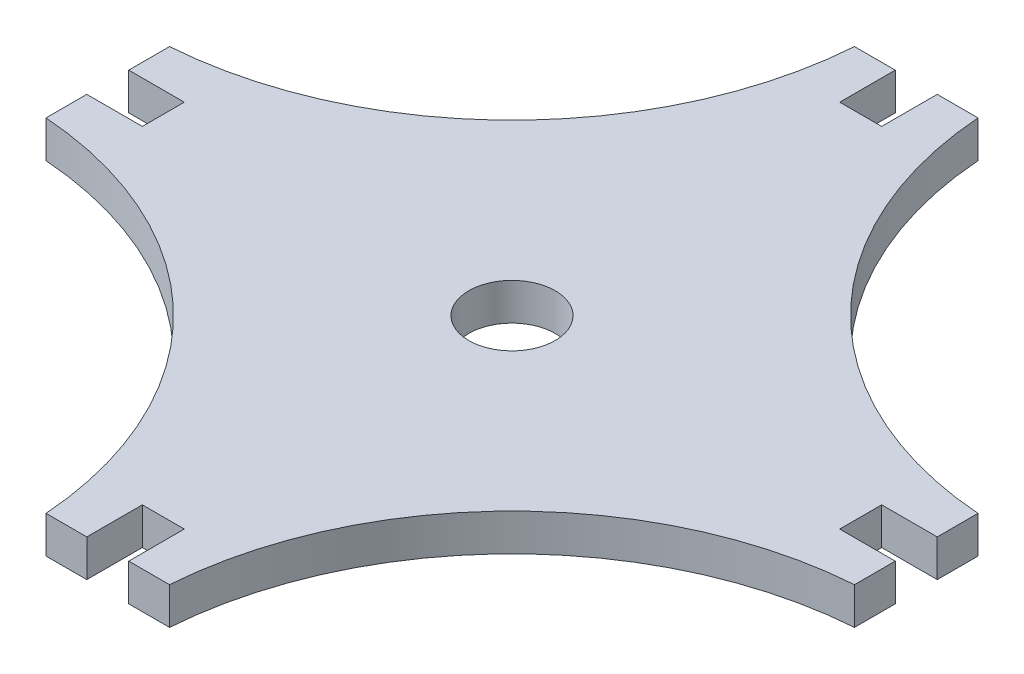
ISO-10303-21;
HEADER;
FILE_DESCRIPTION(('STEP AP214'),'2;1');
FILE_NAME('part.step','',(''),(''),'','','');
FILE_SCHEMA(('AUTOMOTIVE_DESIGN { 1 0 10303 214 1 1 1 1 }'));
ENDSEC;
DATA;
#1=APPLICATION_CONTEXT('core data for automotive mechanical design processes');
#2=APPLICATION_PROTOCOL_DEFINITION('international standard','automotive_design',2000,#1);
#3=PRODUCT_CONTEXT('',#1,'mechanical');
#4=PRODUCT('Part','Part','',(#3));
#5=PRODUCT_RELATED_PRODUCT_CATEGORY('part','',(#4));
#6=PRODUCT_DEFINITION_FORMATION('','',#4);
#7=PRODUCT_DEFINITION_CONTEXT('part definition',#1,'design');
#8=PRODUCT_DEFINITION('design','',#6,#7);
#9=PRODUCT_DEFINITION_SHAPE('','',#8);
#10=(LENGTH_UNIT() NAMED_UNIT(*) SI_UNIT(.MILLI.,.METRE.));
#11=(NAMED_UNIT(*) PLANE_ANGLE_UNIT() SI_UNIT($,.RADIAN.));
#12=(NAMED_UNIT(*) SI_UNIT($,.STERADIAN.) SOLID_ANGLE_UNIT());
#13=UNCERTAINTY_MEASURE_WITH_UNIT(LENGTH_MEASURE(1.E-05),#10,'distance_accuracy_value','');
#14=(GEOMETRIC_REPRESENTATION_CONTEXT(3) GLOBAL_UNCERTAINTY_ASSIGNED_CONTEXT((#13)) GLOBAL_UNIT_ASSIGNED_CONTEXT((#10,
#11,#12)) REPRESENTATION_CONTEXT('',''));
#15=CARTESIAN_POINT('',(0.,0.,0.));
#16=DIRECTION('',(0.,0.,1.));
#17=DIRECTION('',(1.,0.,0.));
#18=AXIS2_PLACEMENT_3D('',#15,#16,#17);
#19=CARTESIAN_POINT('',(34.925,1.5,-34.925));
#20=DIRECTION('',(0.,1.,0.));
#21=DIRECTION('',(0.,0.,1.));
#22=AXIS2_PLACEMENT_3D('',#19,#20,#21);
#23=PLANE('',#22);
#24=DIRECTION('',(0.,0.,1.));
#25=VECTOR('',#24,1.);
#26=CARTESIAN_POINT('',(1.7,1.5,-28.25));
#27=LINE('',#26,#25);
#28=CARTESIAN_POINT('',(1.7,1.5,-32.75));
#29=VERTEX_POINT('',#28);
#30=CARTESIAN_POINT('',(1.7,1.5,-28.25));
#31=VERTEX_POINT('',#30);
#32=EDGE_CURVE('E279',#29,#31,#27,.T.);
#33=ORIENTED_EDGE('',*,*,#32,.T.);
#34=DIRECTION('',(-1.,0.,0.));
#35=VECTOR('',#34,1.);
#36=CARTESIAN_POINT('',(-1.7,1.5,-28.25));
#37=LINE('',#36,#35);
#38=CARTESIAN_POINT('',(-1.7,1.5,-28.25));
#39=VERTEX_POINT('',#38);
#40=EDGE_CURVE('E147',#31,#39,#37,.T.);
#41=ORIENTED_EDGE('',*,*,#40,.T.);
#42=DIRECTION('',(0.,0.,-1.));
#43=VECTOR('',#42,1.);
#44=CARTESIAN_POINT('',(-1.7,1.5,-28.25));
#45=LINE('',#44,#43);
#46=CARTESIAN_POINT('',(-1.7,1.5,-32.75));
#47=VERTEX_POINT('',#46);
#48=EDGE_CURVE('E342',#39,#47,#45,.T.);
#49=ORIENTED_EDGE('',*,*,#48,.T.);
#50=DIRECTION('',(-1.,0.,0.));
#51=VECTOR('',#50,1.);
#52=CARTESIAN_POINT('',(-1.7,1.5,-32.75));
#53=LINE('',#52,#51);
#54=CARTESIAN_POINT('',(-5.00394762880155,1.5,-32.75));
#55=VERTEX_POINT('',#54);
#56=EDGE_CURVE('E361',#47,#55,#53,.T.);
#57=ORIENTED_EDGE('',*,*,#56,.T.);
#58=CARTESIAN_POINT('',(-34.925,1.5,-34.925));
#59=DIRECTION('',(0.,-1.,0.));
#60=DIRECTION('',(0.,0.,-1.));
#61=AXIS2_PLACEMENT_3D('',#58,#59,#60);
#62=CIRCLE('',#61,30.);
#63=CARTESIAN_POINT('',(-32.75,1.5,-5.00394762880155));
#64=VERTEX_POINT('',#63);
#65=EDGE_CURVE('E358',#55,#64,#62,.T.);
#66=ORIENTED_EDGE('',*,*,#65,.T.);
#67=DIRECTION('',(0.,0.,1.));
#68=VECTOR('',#67,1.);
#69=CARTESIAN_POINT('',(-32.75,1.5,-1.7));
#70=LINE('',#69,#68);
#71=CARTESIAN_POINT('',(-32.75,1.5,-1.7));
#72=VERTEX_POINT('',#71);
#73=EDGE_CURVE('E360',#64,#72,#70,.T.);
#74=ORIENTED_EDGE('',*,*,#73,.T.);
#75=DIRECTION('',(1.,0.,0.));
#76=VECTOR('',#75,1.);
#77=CARTESIAN_POINT('',(-28.25,1.5,-1.7));
#78=LINE('',#77,#76);
#79=CARTESIAN_POINT('',(-28.25,1.5,-1.7));
#80=VERTEX_POINT('',#79);
#81=EDGE_CURVE('E363',#72,#80,#78,.T.);
#82=ORIENTED_EDGE('',*,*,#81,.T.);
#83=DIRECTION('',(0.,0.,1.));
#84=VECTOR('',#83,1.);
#85=CARTESIAN_POINT('',(-28.25,1.5,1.7));
#86=LINE('',#85,#84);
#87=CARTESIAN_POINT('',(-28.25,1.5,1.7));
#88=VERTEX_POINT('',#87);
#89=EDGE_CURVE('E369',#80,#88,#86,.T.);
#90=ORIENTED_EDGE('',*,*,#89,.T.);
#91=DIRECTION('',(-1.,0.,0.));
#92=VECTOR('',#91,1.);
#93=CARTESIAN_POINT('',(-28.25,1.5,1.7));
#94=LINE('',#93,#92);
#95=CARTESIAN_POINT('',(-32.75,1.5,1.7));
#96=VERTEX_POINT('',#95);
#97=EDGE_CURVE('E371',#88,#96,#94,.T.);
#98=ORIENTED_EDGE('',*,*,#97,.T.);
#99=DIRECTION('',(0.,0.,1.));
#100=VECTOR('',#99,1.);
#101=CARTESIAN_POINT('',(-32.75,1.5,1.7));
#102=LINE('',#101,#100);
#103=CARTESIAN_POINT('',(-32.75,1.5,5.00394762880155));
#104=VERTEX_POINT('',#103);
#105=EDGE_CURVE('E373',#96,#104,#102,.T.);
#106=ORIENTED_EDGE('',*,*,#105,.T.);
#107=CARTESIAN_POINT('',(-34.925,1.5,34.925));
#108=DIRECTION('',(0.,-1.,0.));
#109=DIRECTION('',(0.,0.,-1.));
#110=AXIS2_PLACEMENT_3D('',#107,#108,#109);
#111=CIRCLE('',#110,30.);
#112=CARTESIAN_POINT('',(-5.00394762880156,1.5,32.75));
#113=VERTEX_POINT('',#112);
#114=EDGE_CURVE('E375',#104,#113,#111,.T.);
#115=ORIENTED_EDGE('',*,*,#114,.T.);
#116=DIRECTION('',(1.,0.,0.));
#117=VECTOR('',#116,1.);
#118=CARTESIAN_POINT('',(-1.7,1.5,32.75));
#119=LINE('',#118,#117);
#120=CARTESIAN_POINT('',(-1.7,1.5,32.75));
#121=VERTEX_POINT('',#120);
#122=EDGE_CURVE('E377',#113,#121,#119,.T.);
#123=ORIENTED_EDGE('',*,*,#122,.T.);
#124=DIRECTION('',(0.,0.,-1.));
#125=VECTOR('',#124,1.);
#126=CARTESIAN_POINT('',(-1.7,1.5,28.25));
#127=LINE('',#126,#125);
#128=CARTESIAN_POINT('',(-1.7,1.5,28.25));
#129=VERTEX_POINT('',#128);
#130=EDGE_CURVE('E379',#121,#129,#127,.T.);
#131=ORIENTED_EDGE('',*,*,#130,.T.);
#132=DIRECTION('',(1.,0.,0.));
#133=VECTOR('',#132,1.);
#134=CARTESIAN_POINT('',(-1.7,1.5,28.25));
#135=LINE('',#134,#133);
#136=CARTESIAN_POINT('',(1.7,1.5,28.25));
#137=VERTEX_POINT('',#136);
#138=EDGE_CURVE('E381',#129,#137,#135,.T.);
#139=ORIENTED_EDGE('',*,*,#138,.T.);
#140=DIRECTION('',(0.,0.,1.));
#141=VECTOR('',#140,1.);
#142=CARTESIAN_POINT('',(1.7,1.5,28.25));
#143=LINE('',#142,#141);
#144=CARTESIAN_POINT('',(1.7,1.5,32.75));
#145=VERTEX_POINT('',#144);
#146=EDGE_CURVE('E383',#137,#145,#143,.T.);
#147=ORIENTED_EDGE('',*,*,#146,.T.);
#148=DIRECTION('',(1.,0.,0.));
#149=VECTOR('',#148,1.);
#150=CARTESIAN_POINT('',(1.7,1.5,32.75));
#151=LINE('',#150,#149);
#152=CARTESIAN_POINT('',(5.00394762880156,1.5,32.75));
#153=VERTEX_POINT('',#152);
#154=EDGE_CURVE('E385',#145,#153,#151,.T.);
#155=ORIENTED_EDGE('',*,*,#154,.T.);
#156=CARTESIAN_POINT('',(34.925,1.5,34.925));
#157=DIRECTION('',(0.,-1.,0.));
#158=DIRECTION('',(0.,0.,-1.));
#159=AXIS2_PLACEMENT_3D('',#156,#157,#158);
#160=CIRCLE('',#159,30.);
#161=CARTESIAN_POINT('',(32.75,1.5,5.00394762880157));
#162=VERTEX_POINT('',#161);
#163=EDGE_CURVE('E387',#153,#162,#160,.T.);
#164=ORIENTED_EDGE('',*,*,#163,.T.);
#165=DIRECTION('',(0.,0.,-1.));
#166=VECTOR('',#165,1.);
#167=CARTESIAN_POINT('',(32.75,1.5,1.7));
#168=LINE('',#167,#166);
#169=CARTESIAN_POINT('',(32.75,1.5,1.7));
#170=VERTEX_POINT('',#169);
#171=EDGE_CURVE('E389',#162,#170,#168,.T.);
#172=ORIENTED_EDGE('',*,*,#171,.T.);
#173=DIRECTION('',(-1.,0.,0.));
#174=VECTOR('',#173,1.);
#175=CARTESIAN_POINT('',(28.25,1.5,1.7));
#176=LINE('',#175,#174);
#177=CARTESIAN_POINT('',(28.25,1.5,1.7));
#178=VERTEX_POINT('',#177);
#179=EDGE_CURVE('E391',#170,#178,#176,.T.);
#180=ORIENTED_EDGE('',*,*,#179,.T.);
#181=DIRECTION('',(0.,0.,-1.));
#182=VECTOR('',#181,1.);
#183=CARTESIAN_POINT('',(28.25,1.5,1.7));
#184=LINE('',#183,#182);
#185=CARTESIAN_POINT('',(28.25,1.5,-1.7));
#186=VERTEX_POINT('',#185);
#187=EDGE_CURVE('E393',#178,#186,#184,.T.);
#188=ORIENTED_EDGE('',*,*,#187,.T.);
#189=DIRECTION('',(1.,0.,0.));
#190=VECTOR('',#189,1.);
#191=CARTESIAN_POINT('',(28.25,1.5,-1.7));
#192=LINE('',#191,#190);
#193=CARTESIAN_POINT('',(32.75,1.5,-1.7));
#194=VERTEX_POINT('',#193);
#195=EDGE_CURVE('E214',#186,#194,#192,.T.);
#196=ORIENTED_EDGE('',*,*,#195,.T.);
#197=DIRECTION('',(0.,0.,-1.));
#198=VECTOR('',#197,1.);
#199=CARTESIAN_POINT('',(32.75,1.5,-1.7));
#200=LINE('',#199,#198);
#201=CARTESIAN_POINT('',(32.75,1.5,-5.00394762880156));
#202=VERTEX_POINT('',#201);
#203=EDGE_CURVE('E208',#194,#202,#200,.T.);
#204=ORIENTED_EDGE('',*,*,#203,.T.);
#205=CARTESIAN_POINT('',(34.925,1.5,-34.925));
#206=DIRECTION('',(0.,-1.,0.));
#207=DIRECTION('',(0.,0.,1.));
#208=AXIS2_PLACEMENT_3D('',#205,#206,#207);
#209=CIRCLE('',#208,30.);
#210=CARTESIAN_POINT('',(5.00394762880155,1.5,-32.75));
#211=VERTEX_POINT('',#210);
#212=EDGE_CURVE('E212',#202,#211,#209,.T.);
#213=ORIENTED_EDGE('',*,*,#212,.T.);
#214=DIRECTION('',(-1.,0.,0.));
#215=VECTOR('',#214,1.);
#216=CARTESIAN_POINT('',(1.7,1.5,-32.75));
#217=LINE('',#216,#215);
#218=EDGE_CURVE('E56',#211,#29,#217,.T.);
#219=ORIENTED_EDGE('',*,*,#218,.T.);
#220=EDGE_LOOP('',(#33,#41,#49,#57,#66,#74,#82,#90,#98,#106,#115,#123,#131,#139,#147,#155,#164,
#172,#180,#188,#196,#204,#213,#219));
#221=FACE_BOUND('',#220,.T.);
#222=CARTESIAN_POINT('',(0.,1.5,0.));
#223=DIRECTION('',(0.,1.,0.));
#224=DIRECTION('',(0.,0.,1.));
#225=AXIS2_PLACEMENT_3D('',#222,#223,#224);
#226=CIRCLE('',#225,3.5);
#227=CARTESIAN_POINT('',(0.,1.5,3.5));
#228=VERTEX_POINT('',#227);
#229=EDGE_CURVE('E236',#228,#228,#226,.T.);
#230=ORIENTED_EDGE('',*,*,#229,.F.);
#231=EDGE_LOOP('',(#230));
#232=FACE_BOUND('',#231,.T.);
#233=ADVANCED_FACE('F39',(#221,#232),#23,.T.);
#234=CARTESIAN_POINT('',(34.925,-1.5,-34.925));
#235=DIRECTION('',(0.,1.,0.));
#236=DIRECTION('',(0.,0.,1.));
#237=AXIS2_PLACEMENT_3D('',#234,#235,#236);
#238=PLANE('',#237);
#239=DIRECTION('',(0.,0.,1.));
#240=VECTOR('',#239,1.);
#241=CARTESIAN_POINT('',(1.7,-1.5,-28.25));
#242=LINE('',#241,#240);
#243=CARTESIAN_POINT('',(1.7,-1.5,-32.75));
#244=VERTEX_POINT('',#243);
#245=CARTESIAN_POINT('',(1.7,-1.5,-28.25));
#246=VERTEX_POINT('',#245);
#247=EDGE_CURVE('E232',#244,#246,#242,.T.);
#248=ORIENTED_EDGE('',*,*,#247,.F.);
#249=DIRECTION('',(-1.,0.,0.));
#250=VECTOR('',#249,1.);
#251=CARTESIAN_POINT('',(1.7,-1.5,-32.75));
#252=LINE('',#251,#250);
#253=CARTESIAN_POINT('',(5.00394762880155,-1.5,-32.75));
#254=VERTEX_POINT('',#253);
#255=EDGE_CURVE('E139',#254,#244,#252,.T.);
#256=ORIENTED_EDGE('',*,*,#255,.F.);
#257=CARTESIAN_POINT('',(34.925,-1.5,-34.925));
#258=DIRECTION('',(0.,-1.,0.));
#259=DIRECTION('',(0.,0.,1.));
#260=AXIS2_PLACEMENT_3D('',#257,#258,#259);
#261=CIRCLE('',#260,30.);
#262=CARTESIAN_POINT('',(32.75,-1.5,-5.00394762880156));
#263=VERTEX_POINT('',#262);
#264=EDGE_CURVE('E133',#263,#254,#261,.T.);
#265=ORIENTED_EDGE('',*,*,#264,.F.);
#266=DIRECTION('',(0.,0.,-1.));
#267=VECTOR('',#266,1.);
#268=CARTESIAN_POINT('',(32.75,-1.5,-1.7));
#269=LINE('',#268,#267);
#270=CARTESIAN_POINT('',(32.75,-1.5,-1.7));
#271=VERTEX_POINT('',#270);
#272=EDGE_CURVE('E222',#271,#263,#269,.T.);
#273=ORIENTED_EDGE('',*,*,#272,.F.);
#274=DIRECTION('',(1.,0.,0.));
#275=VECTOR('',#274,1.);
#276=CARTESIAN_POINT('',(28.25,-1.5,-1.7));
#277=LINE('',#276,#275);
#278=CARTESIAN_POINT('',(28.25,-1.5,-1.7));
#279=VERTEX_POINT('',#278);
#280=EDGE_CURVE('E274',#279,#271,#277,.T.);
#281=ORIENTED_EDGE('',*,*,#280,.F.);
#282=DIRECTION('',(0.,0.,-1.));
#283=VECTOR('',#282,1.);
#284=CARTESIAN_POINT('',(28.25,-1.5,1.7));
#285=LINE('',#284,#283);
#286=CARTESIAN_POINT('',(28.25,-1.5,1.7));
#287=VERTEX_POINT('',#286);
#288=EDGE_CURVE('E272',#287,#279,#285,.T.);
#289=ORIENTED_EDGE('',*,*,#288,.F.);
#290=DIRECTION('',(-1.,0.,0.));
#291=VECTOR('',#290,1.);
#292=CARTESIAN_POINT('',(28.25,-1.5,1.7));
#293=LINE('',#292,#291);
#294=CARTESIAN_POINT('',(32.75,-1.5,1.7));
#295=VERTEX_POINT('',#294);
#296=EDGE_CURVE('E270',#295,#287,#293,.T.);
#297=ORIENTED_EDGE('',*,*,#296,.F.);
#298=DIRECTION('',(0.,0.,-1.));
#299=VECTOR('',#298,1.);
#300=CARTESIAN_POINT('',(32.75,-1.5,1.7));
#301=LINE('',#300,#299);
#302=CARTESIAN_POINT('',(32.75,-1.5,5.00394762880157));
#303=VERTEX_POINT('',#302);
#304=EDGE_CURVE('E268',#303,#295,#301,.T.);
#305=ORIENTED_EDGE('',*,*,#304,.F.);
#306=CARTESIAN_POINT('',(34.925,-1.5,34.925));
#307=DIRECTION('',(0.,-1.,0.));
#308=DIRECTION('',(0.,0.,-1.));
#309=AXIS2_PLACEMENT_3D('',#306,#307,#308);
#310=CIRCLE('',#309,30.);
#311=CARTESIAN_POINT('',(5.00394762880156,-1.5,32.75));
#312=VERTEX_POINT('',#311);
#313=EDGE_CURVE('E266',#312,#303,#310,.T.);
#314=ORIENTED_EDGE('',*,*,#313,.F.);
#315=DIRECTION('',(1.,0.,0.));
#316=VECTOR('',#315,1.);
#317=CARTESIAN_POINT('',(1.7,-1.5,32.75));
#318=LINE('',#317,#316);
#319=CARTESIAN_POINT('',(1.7,-1.5,32.75));
#320=VERTEX_POINT('',#319);
#321=EDGE_CURVE('E264',#320,#312,#318,.T.);
#322=ORIENTED_EDGE('',*,*,#321,.F.);
#323=DIRECTION('',(0.,0.,1.));
#324=VECTOR('',#323,1.);
#325=CARTESIAN_POINT('',(1.7,-1.5,28.25));
#326=LINE('',#325,#324);
#327=CARTESIAN_POINT('',(1.7,-1.5,28.25));
#328=VERTEX_POINT('',#327);
#329=EDGE_CURVE('E262',#328,#320,#326,.T.);
#330=ORIENTED_EDGE('',*,*,#329,.F.);
#331=DIRECTION('',(1.,0.,0.));
#332=VECTOR('',#331,1.);
#333=CARTESIAN_POINT('',(-1.7,-1.5,28.25));
#334=LINE('',#333,#332);
#335=CARTESIAN_POINT('',(-1.7,-1.5,28.25));
#336=VERTEX_POINT('',#335);
#337=EDGE_CURVE('E260',#336,#328,#334,.T.);
#338=ORIENTED_EDGE('',*,*,#337,.F.);
#339=DIRECTION('',(0.,0.,-1.));
#340=VECTOR('',#339,1.);
#341=CARTESIAN_POINT('',(-1.7,-1.5,28.25));
#342=LINE('',#341,#340);
#343=CARTESIAN_POINT('',(-1.7,-1.5,32.75));
#344=VERTEX_POINT('',#343);
#345=EDGE_CURVE('E258',#344,#336,#342,.T.);
#346=ORIENTED_EDGE('',*,*,#345,.F.);
#347=DIRECTION('',(1.,0.,0.));
#348=VECTOR('',#347,1.);
#349=CARTESIAN_POINT('',(-1.7,-1.5,32.75));
#350=LINE('',#349,#348);
#351=CARTESIAN_POINT('',(-5.00394762880156,-1.5,32.75));
#352=VERTEX_POINT('',#351);
#353=EDGE_CURVE('E256',#352,#344,#350,.T.);
#354=ORIENTED_EDGE('',*,*,#353,.F.);
#355=CARTESIAN_POINT('',(-34.925,-1.5,34.925));
#356=DIRECTION('',(0.,-1.,0.));
#357=DIRECTION('',(0.,0.,-1.));
#358=AXIS2_PLACEMENT_3D('',#355,#356,#357);
#359=CIRCLE('',#358,30.);
#360=CARTESIAN_POINT('',(-32.75,-1.5,5.00394762880155));
#361=VERTEX_POINT('',#360);
#362=EDGE_CURVE('E254',#361,#352,#359,.T.);
#363=ORIENTED_EDGE('',*,*,#362,.F.);
#364=DIRECTION('',(0.,0.,1.));
#365=VECTOR('',#364,1.);
#366=CARTESIAN_POINT('',(-32.75,-1.5,1.7));
#367=LINE('',#366,#365);
#368=CARTESIAN_POINT('',(-32.75,-1.5,1.7));
#369=VERTEX_POINT('',#368);
#370=EDGE_CURVE('E252',#369,#361,#367,.T.);
#371=ORIENTED_EDGE('',*,*,#370,.F.);
#372=DIRECTION('',(-1.,0.,0.));
#373=VECTOR('',#372,1.);
#374=CARTESIAN_POINT('',(-28.25,-1.5,1.7));
#375=LINE('',#374,#373);
#376=CARTESIAN_POINT('',(-28.25,-1.5,1.7));
#377=VERTEX_POINT('',#376);
#378=EDGE_CURVE('E250',#377,#369,#375,.T.);
#379=ORIENTED_EDGE('',*,*,#378,.F.);
#380=DIRECTION('',(0.,0.,1.));
#381=VECTOR('',#380,1.);
#382=CARTESIAN_POINT('',(-28.25,-1.5,1.7));
#383=LINE('',#382,#381);
#384=CARTESIAN_POINT('',(-28.25,-1.5,-1.7));
#385=VERTEX_POINT('',#384);
#386=EDGE_CURVE('E248',#385,#377,#383,.T.);
#387=ORIENTED_EDGE('',*,*,#386,.F.);
#388=DIRECTION('',(1.,0.,0.));
#389=VECTOR('',#388,1.);
#390=CARTESIAN_POINT('',(-28.25,-1.5,-1.7));
#391=LINE('',#390,#389);
#392=CARTESIAN_POINT('',(-32.75,-1.5,-1.7));
#393=VERTEX_POINT('',#392);
#394=EDGE_CURVE('E246',#393,#385,#391,.T.);
#395=ORIENTED_EDGE('',*,*,#394,.F.);
#396=DIRECTION('',(0.,0.,1.));
#397=VECTOR('',#396,1.);
#398=CARTESIAN_POINT('',(-32.75,-1.5,-1.7));
#399=LINE('',#398,#397);
#400=CARTESIAN_POINT('',(-32.75,-1.5,-5.00394762880155));
#401=VERTEX_POINT('',#400);
#402=EDGE_CURVE('E244',#401,#393,#399,.T.);
#403=ORIENTED_EDGE('',*,*,#402,.F.);
#404=CARTESIAN_POINT('',(-34.925,-1.5,-34.925));
#405=DIRECTION('',(0.,-1.,0.));
#406=DIRECTION('',(0.,0.,-1.));
#407=AXIS2_PLACEMENT_3D('',#404,#405,#406);
#408=CIRCLE('',#407,30.);
#409=CARTESIAN_POINT('',(-5.00394762880155,-1.5,-32.75));
#410=VERTEX_POINT('',#409);
#411=EDGE_CURVE('E242',#410,#401,#408,.T.);
#412=ORIENTED_EDGE('',*,*,#411,.F.);
#413=DIRECTION('',(-1.,0.,0.));
#414=VECTOR('',#413,1.);
#415=CARTESIAN_POINT('',(-1.7,-1.5,-32.75));
#416=LINE('',#415,#414);
#417=CARTESIAN_POINT('',(-1.7,-1.5,-32.75));
#418=VERTEX_POINT('',#417);
#419=EDGE_CURVE('E240',#418,#410,#416,.T.);
#420=ORIENTED_EDGE('',*,*,#419,.F.);
#421=DIRECTION('',(0.,0.,-1.));
#422=VECTOR('',#421,1.);
#423=CARTESIAN_POINT('',(-1.7,-1.5,-28.25));
#424=LINE('',#423,#422);
#425=CARTESIAN_POINT('',(-1.7,-1.5,-28.25));
#426=VERTEX_POINT('',#425);
#427=EDGE_CURVE('E238',#426,#418,#424,.T.);
#428=ORIENTED_EDGE('',*,*,#427,.F.);
#429=DIRECTION('',(-1.,0.,0.));
#430=VECTOR('',#429,1.);
#431=CARTESIAN_POINT('',(-1.7,-1.5,-28.25));
#432=LINE('',#431,#430);
#433=EDGE_CURVE('E235',#246,#426,#432,.T.);
#434=ORIENTED_EDGE('',*,*,#433,.F.);
#435=EDGE_LOOP('',(#248,#256,#265,#273,#281,#289,#297,#305,#314,#322,#330,#338,#346,#354,#363,
#371,#379,#387,#395,#403,#412,#420,#428,#434));
#436=FACE_BOUND('',#435,.T.);
#437=CARTESIAN_POINT('',(0.,-1.5,0.));
#438=DIRECTION('',(0.,1.,0.));
#439=DIRECTION('',(0.,0.,1.));
#440=AXIS2_PLACEMENT_3D('',#437,#438,#439);
#441=CIRCLE('',#440,3.5);
#442=CARTESIAN_POINT('',(0.,-1.5,3.5));
#443=VERTEX_POINT('',#442);
#444=EDGE_CURVE('E696',#443,#443,#441,.T.);
#445=ORIENTED_EDGE('',*,*,#444,.T.);
#446=EDGE_LOOP('',(#445));
#447=FACE_BOUND('',#446,.T.);
#448=ADVANCED_FACE('F346',(#436,#447),#238,.F.);
#449=CARTESIAN_POINT('',(1.7,1.5,-28.25));
#450=DIRECTION('',(1.,0.,0.));
#451=DIRECTION('',(0.,0.,-1.));
#452=AXIS2_PLACEMENT_3D('',#449,#450,#451);
#453=PLANE('',#452);
#454=ORIENTED_EDGE('',*,*,#247,.T.);
#455=DIRECTION('',(0.,-1.,0.));
#456=VECTOR('',#455,1.);
#457=CARTESIAN_POINT('',(1.7,1.5,-28.25));
#458=LINE('',#457,#456);
#459=EDGE_CURVE('E11',#31,#246,#458,.T.);
#460=ORIENTED_EDGE('',*,*,#459,.F.);
#461=ORIENTED_EDGE('',*,*,#32,.F.);
#462=DIRECTION('',(0.,-1.,0.));
#463=VECTOR('',#462,1.);
#464=CARTESIAN_POINT('',(1.7,1.5,-32.75));
#465=LINE('',#464,#463);
#466=EDGE_CURVE('E228',#29,#244,#465,.T.);
#467=ORIENTED_EDGE('',*,*,#466,.T.);
#468=EDGE_LOOP('',(#454,#460,#461,#467));
#469=FACE_BOUND('',#468,.T.);
#470=ADVANCED_FACE('F41',(#469),#453,.F.);
#471=CARTESIAN_POINT('',(-1.7,1.5,-28.25));
#472=DIRECTION('',(0.,0.,1.));
#473=DIRECTION('',(1.,0.,0.));
#474=AXIS2_PLACEMENT_3D('',#471,#472,#473);
#475=PLANE('',#474);
#476=ORIENTED_EDGE('',*,*,#433,.T.);
#477=DIRECTION('',(0.,-1.,0.));
#478=VECTOR('',#477,1.);
#479=CARTESIAN_POINT('',(-1.7,1.5,-28.25));
#480=LINE('',#479,#478);
#481=EDGE_CURVE('E48',#39,#426,#480,.T.);
#482=ORIENTED_EDGE('',*,*,#481,.F.);
#483=ORIENTED_EDGE('',*,*,#40,.F.);
#484=ORIENTED_EDGE('',*,*,#459,.T.);
#485=EDGE_LOOP('',(#476,#482,#483,#484));
#486=FACE_BOUND('',#485,.T.);
#487=ADVANCED_FACE('F427',(#486),#475,.F.);
#488=CARTESIAN_POINT('',(-1.7,1.5,-28.25));
#489=DIRECTION('',(-1.,0.,0.));
#490=DIRECTION('',(0.,0.,1.));
#491=AXIS2_PLACEMENT_3D('',#488,#489,#490);
#492=PLANE('',#491);
#493=ORIENTED_EDGE('',*,*,#427,.T.);
#494=DIRECTION('',(0.,-1.,0.));
#495=VECTOR('',#494,1.);
#496=CARTESIAN_POINT('',(-1.7,1.5,-32.75));
#497=LINE('',#496,#495);
#498=EDGE_CURVE('E334',#47,#418,#497,.T.);
#499=ORIENTED_EDGE('',*,*,#498,.F.);
#500=ORIENTED_EDGE('',*,*,#48,.F.);
#501=ORIENTED_EDGE('',*,*,#481,.T.);
#502=EDGE_LOOP('',(#493,#499,#500,#501));
#503=FACE_BOUND('',#502,.T.);
#504=ADVANCED_FACE('F340',(#503),#492,.F.);
#505=CARTESIAN_POINT('',(-1.7,1.5,-32.75));
#506=DIRECTION('',(0.,0.,1.));
#507=DIRECTION('',(1.,0.,0.));
#508=AXIS2_PLACEMENT_3D('',#505,#506,#507);
#509=PLANE('',#508);
#510=ORIENTED_EDGE('',*,*,#419,.T.);
#511=DIRECTION('',(0.,-1.,0.));
#512=VECTOR('',#511,1.);
#513=CARTESIAN_POINT('',(-5.00394762880155,1.5,-32.75));
#514=LINE('',#513,#512);
#515=EDGE_CURVE('E331',#55,#410,#514,.T.);
#516=ORIENTED_EDGE('',*,*,#515,.F.);
#517=ORIENTED_EDGE('',*,*,#56,.F.);
#518=ORIENTED_EDGE('',*,*,#498,.T.);
#519=EDGE_LOOP('',(#510,#516,#517,#518));
#520=FACE_BOUND('',#519,.T.);
#521=ADVANCED_FACE('F352',(#520),#509,.F.);
#522=CARTESIAN_POINT('',(-34.925,1.5,-34.925));
#523=DIRECTION('',(0.,-1.,0.));
#524=DIRECTION('',(0.,0.,-1.));
#525=AXIS2_PLACEMENT_3D('',#522,#523,#524);
#526=CYLINDRICAL_SURFACE('',#525,30.);
#527=ORIENTED_EDGE('',*,*,#411,.T.);
#528=DIRECTION('',(0.,-1.,0.));
#529=VECTOR('',#528,1.);
#530=CARTESIAN_POINT('',(-32.75,1.5,-5.00394762880155));
#531=LINE('',#530,#529);
#532=EDGE_CURVE('E328',#64,#401,#531,.T.);
#533=ORIENTED_EDGE('',*,*,#532,.F.);
#534=ORIENTED_EDGE('',*,*,#65,.F.);
#535=ORIENTED_EDGE('',*,*,#515,.T.);
#536=EDGE_LOOP('',(#527,#533,#534,#535));
#537=FACE_BOUND('',#536,.T.);
#538=ADVANCED_FACE('F356',(#537),#526,.F.);
#539=CARTESIAN_POINT('',(-32.75,1.5,-1.7));
#540=DIRECTION('',(1.,0.,0.));
#541=DIRECTION('',(0.,0.,-1.));
#542=AXIS2_PLACEMENT_3D('',#539,#540,#541);
#543=PLANE('',#542);
#544=ORIENTED_EDGE('',*,*,#402,.T.);
#545=DIRECTION('',(0.,-1.,0.));
#546=VECTOR('',#545,1.);
#547=CARTESIAN_POINT('',(-32.75,1.5,-1.7));
#548=LINE('',#547,#546);
#549=EDGE_CURVE('E325',#72,#393,#548,.T.);
#550=ORIENTED_EDGE('',*,*,#549,.F.);
#551=ORIENTED_EDGE('',*,*,#73,.F.);
#552=ORIENTED_EDGE('',*,*,#532,.T.);
#553=EDGE_LOOP('',(#544,#550,#551,#552));
#554=FACE_BOUND('',#553,.T.);
#555=ADVANCED_FACE('F440',(#554),#543,.F.);
#556=CARTESIAN_POINT('',(-28.25,1.5,-1.7));
#557=DIRECTION('',(0.,0.,-1.));
#558=DIRECTION('',(-1.,0.,0.));
#559=AXIS2_PLACEMENT_3D('',#556,#557,#558);
#560=PLANE('',#559);
#561=ORIENTED_EDGE('',*,*,#394,.T.);
#562=DIRECTION('',(0.,-1.,0.));
#563=VECTOR('',#562,1.);
#564=CARTESIAN_POINT('',(-28.25,1.5,-1.7));
#565=LINE('',#564,#563);
#566=EDGE_CURVE('E322',#80,#385,#565,.T.);
#567=ORIENTED_EDGE('',*,*,#566,.F.);
#568=ORIENTED_EDGE('',*,*,#81,.F.);
#569=ORIENTED_EDGE('',*,*,#549,.T.);
#570=EDGE_LOOP('',(#561,#567,#568,#569));
#571=FACE_BOUND('',#570,.T.);
#572=ADVANCED_FACE('F443',(#571),#560,.F.);
#573=CARTESIAN_POINT('',(-28.25,1.5,1.7));
#574=DIRECTION('',(1.,0.,0.));
#575=DIRECTION('',(0.,0.,-1.));
#576=AXIS2_PLACEMENT_3D('',#573,#574,#575);
#577=PLANE('',#576);
#578=ORIENTED_EDGE('',*,*,#386,.T.);
#579=DIRECTION('',(0.,-1.,0.));
#580=VECTOR('',#579,1.);
#581=CARTESIAN_POINT('',(-28.25,1.5,1.7));
#582=LINE('',#581,#580);
#583=EDGE_CURVE('E319',#88,#377,#582,.T.);
#584=ORIENTED_EDGE('',*,*,#583,.F.);
#585=ORIENTED_EDGE('',*,*,#89,.F.);
#586=ORIENTED_EDGE('',*,*,#566,.T.);
#587=EDGE_LOOP('',(#578,#584,#585,#586));
#588=FACE_BOUND('',#587,.T.);
#589=ADVANCED_FACE('F447',(#588),#577,.F.);
#590=CARTESIAN_POINT('',(-28.25,1.5,1.7));
#591=DIRECTION('',(0.,0.,1.));
#592=DIRECTION('',(1.,0.,0.));
#593=AXIS2_PLACEMENT_3D('',#590,#591,#592);
#594=PLANE('',#593);
#595=ORIENTED_EDGE('',*,*,#378,.T.);
#596=DIRECTION('',(0.,-1.,0.));
#597=VECTOR('',#596,1.);
#598=CARTESIAN_POINT('',(-32.75,1.5,1.7));
#599=LINE('',#598,#597);
#600=EDGE_CURVE('E316',#96,#369,#599,.T.);
#601=ORIENTED_EDGE('',*,*,#600,.F.);
#602=ORIENTED_EDGE('',*,*,#97,.F.);
#603=ORIENTED_EDGE('',*,*,#583,.T.);
#604=EDGE_LOOP('',(#595,#601,#602,#603));
#605=FACE_BOUND('',#604,.T.);
#606=ADVANCED_FACE('F451',(#605),#594,.F.);
#607=CARTESIAN_POINT('',(-32.75,1.5,1.7));
#608=DIRECTION('',(1.,0.,0.));
#609=DIRECTION('',(0.,0.,-1.));
#610=AXIS2_PLACEMENT_3D('',#607,#608,#609);
#611=PLANE('',#610);
#612=ORIENTED_EDGE('',*,*,#370,.T.);
#613=DIRECTION('',(0.,-1.,0.));
#614=VECTOR('',#613,1.);
#615=CARTESIAN_POINT('',(-32.75,1.5,5.00394762880155));
#616=LINE('',#615,#614);
#617=EDGE_CURVE('E313',#104,#361,#616,.T.);
#618=ORIENTED_EDGE('',*,*,#617,.F.);
#619=ORIENTED_EDGE('',*,*,#105,.F.);
#620=ORIENTED_EDGE('',*,*,#600,.T.);
#621=EDGE_LOOP('',(#612,#618,#619,#620));
#622=FACE_BOUND('',#621,.T.);
#623=ADVANCED_FACE('F455',(#622),#611,.F.);
#624=CARTESIAN_POINT('',(-34.925,1.5,34.925));
#625=DIRECTION('',(0.,-1.,0.));
#626=DIRECTION('',(0.,0.,-1.));
#627=AXIS2_PLACEMENT_3D('',#624,#625,#626);
#628=CYLINDRICAL_SURFACE('',#627,30.);
#629=ORIENTED_EDGE('',*,*,#362,.T.);
#630=DIRECTION('',(0.,-1.,0.));
#631=VECTOR('',#630,1.);
#632=CARTESIAN_POINT('',(-5.00394762880156,1.5,32.75));
#633=LINE('',#632,#631);
#634=EDGE_CURVE('E310',#113,#352,#633,.T.);
#635=ORIENTED_EDGE('',*,*,#634,.F.);
#636=ORIENTED_EDGE('',*,*,#114,.F.);
#637=ORIENTED_EDGE('',*,*,#617,.T.);
#638=EDGE_LOOP('',(#629,#635,#636,#637));
#639=FACE_BOUND('',#638,.T.);
#640=ADVANCED_FACE('F459',(#639),#628,.F.);
#641=CARTESIAN_POINT('',(-1.7,1.5,32.75));
#642=DIRECTION('',(0.,0.,-1.));
#643=DIRECTION('',(-1.,0.,0.));
#644=AXIS2_PLACEMENT_3D('',#641,#642,#643);
#645=PLANE('',#644);
#646=ORIENTED_EDGE('',*,*,#353,.T.);
#647=DIRECTION('',(0.,-1.,0.));
#648=VECTOR('',#647,1.);
#649=CARTESIAN_POINT('',(-1.7,1.5,32.75));
#650=LINE('',#649,#648);
#651=EDGE_CURVE('E307',#121,#344,#650,.T.);
#652=ORIENTED_EDGE('',*,*,#651,.F.);
#653=ORIENTED_EDGE('',*,*,#122,.F.);
#654=ORIENTED_EDGE('',*,*,#634,.T.);
#655=EDGE_LOOP('',(#646,#652,#653,#654));
#656=FACE_BOUND('',#655,.T.);
#657=ADVANCED_FACE('F463',(#656),#645,.F.);
#658=CARTESIAN_POINT('',(-1.7,1.5,28.25));
#659=DIRECTION('',(-1.,0.,0.));
#660=DIRECTION('',(0.,0.,1.));
#661=AXIS2_PLACEMENT_3D('',#658,#659,#660);
#662=PLANE('',#661);
#663=ORIENTED_EDGE('',*,*,#345,.T.);
#664=DIRECTION('',(0.,-1.,0.));
#665=VECTOR('',#664,1.);
#666=CARTESIAN_POINT('',(-1.7,1.5,28.25));
#667=LINE('',#666,#665);
#668=EDGE_CURVE('E304',#129,#336,#667,.T.);
#669=ORIENTED_EDGE('',*,*,#668,.F.);
#670=ORIENTED_EDGE('',*,*,#130,.F.);
#671=ORIENTED_EDGE('',*,*,#651,.T.);
#672=EDGE_LOOP('',(#663,#669,#670,#671));
#673=FACE_BOUND('',#672,.T.);
#674=ADVANCED_FACE('F467',(#673),#662,.F.);
#675=CARTESIAN_POINT('',(-1.7,1.5,28.25));
#676=DIRECTION('',(0.,0.,-1.));
#677=DIRECTION('',(-1.,0.,0.));
#678=AXIS2_PLACEMENT_3D('',#675,#676,#677);
#679=PLANE('',#678);
#680=ORIENTED_EDGE('',*,*,#337,.T.);
#681=DIRECTION('',(0.,-1.,0.));
#682=VECTOR('',#681,1.);
#683=CARTESIAN_POINT('',(1.7,1.5,28.25));
#684=LINE('',#683,#682);
#685=EDGE_CURVE('E301',#137,#328,#684,.T.);
#686=ORIENTED_EDGE('',*,*,#685,.F.);
#687=ORIENTED_EDGE('',*,*,#138,.F.);
#688=ORIENTED_EDGE('',*,*,#668,.T.);
#689=EDGE_LOOP('',(#680,#686,#687,#688));
#690=FACE_BOUND('',#689,.T.);
#691=ADVANCED_FACE('F471',(#690),#679,.F.);
#692=CARTESIAN_POINT('',(1.7,1.5,28.25));
#693=DIRECTION('',(1.,0.,0.));
#694=DIRECTION('',(0.,0.,-1.));
#695=AXIS2_PLACEMENT_3D('',#692,#693,#694);
#696=PLANE('',#695);
#697=ORIENTED_EDGE('',*,*,#329,.T.);
#698=DIRECTION('',(0.,-1.,0.));
#699=VECTOR('',#698,1.);
#700=CARTESIAN_POINT('',(1.7,1.5,32.75));
#701=LINE('',#700,#699);
#702=EDGE_CURVE('E298',#145,#320,#701,.T.);
#703=ORIENTED_EDGE('',*,*,#702,.F.);
#704=ORIENTED_EDGE('',*,*,#146,.F.);
#705=ORIENTED_EDGE('',*,*,#685,.T.);
#706=EDGE_LOOP('',(#697,#703,#704,#705));
#707=FACE_BOUND('',#706,.T.);
#708=ADVANCED_FACE('F475',(#707),#696,.F.);
#709=CARTESIAN_POINT('',(1.7,1.5,32.75));
#710=DIRECTION('',(0.,0.,-1.));
#711=DIRECTION('',(-1.,0.,0.));
#712=AXIS2_PLACEMENT_3D('',#709,#710,#711);
#713=PLANE('',#712);
#714=ORIENTED_EDGE('',*,*,#321,.T.);
#715=DIRECTION('',(0.,-1.,0.));
#716=VECTOR('',#715,1.);
#717=CARTESIAN_POINT('',(5.00394762880156,1.5,32.75));
#718=LINE('',#717,#716);
#719=EDGE_CURVE('E295',#153,#312,#718,.T.);
#720=ORIENTED_EDGE('',*,*,#719,.F.);
#721=ORIENTED_EDGE('',*,*,#154,.F.);
#722=ORIENTED_EDGE('',*,*,#702,.T.);
#723=EDGE_LOOP('',(#714,#720,#721,#722));
#724=FACE_BOUND('',#723,.T.);
#725=ADVANCED_FACE('F479',(#724),#713,.F.);
#726=CARTESIAN_POINT('',(34.925,1.5,34.925));
#727=DIRECTION('',(0.,-1.,0.));
#728=DIRECTION('',(0.,0.,-1.));
#729=AXIS2_PLACEMENT_3D('',#726,#727,#728);
#730=CYLINDRICAL_SURFACE('',#729,30.);
#731=ORIENTED_EDGE('',*,*,#313,.T.);
#732=DIRECTION('',(0.,-1.,0.));
#733=VECTOR('',#732,1.);
#734=CARTESIAN_POINT('',(32.75,1.5,5.00394762880157));
#735=LINE('',#734,#733);
#736=EDGE_CURVE('E292',#162,#303,#735,.T.);
#737=ORIENTED_EDGE('',*,*,#736,.F.);
#738=ORIENTED_EDGE('',*,*,#163,.F.);
#739=ORIENTED_EDGE('',*,*,#719,.T.);
#740=EDGE_LOOP('',(#731,#737,#738,#739));
#741=FACE_BOUND('',#740,.T.);
#742=ADVANCED_FACE('F483',(#741),#730,.F.);
#743=CARTESIAN_POINT('',(32.75,1.5,1.7));
#744=DIRECTION('',(-1.,0.,0.));
#745=DIRECTION('',(0.,0.,1.));
#746=AXIS2_PLACEMENT_3D('',#743,#744,#745);
#747=PLANE('',#746);
#748=ORIENTED_EDGE('',*,*,#304,.T.);
#749=DIRECTION('',(0.,-1.,0.));
#750=VECTOR('',#749,1.);
#751=CARTESIAN_POINT('',(32.75,1.5,1.7));
#752=LINE('',#751,#750);
#753=EDGE_CURVE('E289',#170,#295,#752,.T.);
#754=ORIENTED_EDGE('',*,*,#753,.F.);
#755=ORIENTED_EDGE('',*,*,#171,.F.);
#756=ORIENTED_EDGE('',*,*,#736,.T.);
#757=EDGE_LOOP('',(#748,#754,#755,#756));
#758=FACE_BOUND('',#757,.T.);
#759=ADVANCED_FACE('F487',(#758),#747,.F.);
#760=CARTESIAN_POINT('',(28.25,1.5,1.7));
#761=DIRECTION('',(0.,0.,1.));
#762=DIRECTION('',(1.,0.,0.));
#763=AXIS2_PLACEMENT_3D('',#760,#761,#762);
#764=PLANE('',#763);
#765=ORIENTED_EDGE('',*,*,#296,.T.);
#766=DIRECTION('',(0.,-1.,0.));
#767=VECTOR('',#766,1.);
#768=CARTESIAN_POINT('',(28.25,1.5,1.7));
#769=LINE('',#768,#767);
#770=EDGE_CURVE('E286',#178,#287,#769,.T.);
#771=ORIENTED_EDGE('',*,*,#770,.F.);
#772=ORIENTED_EDGE('',*,*,#179,.F.);
#773=ORIENTED_EDGE('',*,*,#753,.T.);
#774=EDGE_LOOP('',(#765,#771,#772,#773));
#775=FACE_BOUND('',#774,.T.);
#776=ADVANCED_FACE('F491',(#775),#764,.F.);
#777=CARTESIAN_POINT('',(28.25,1.5,1.7));
#778=DIRECTION('',(-1.,0.,0.));
#779=DIRECTION('',(0.,0.,1.));
#780=AXIS2_PLACEMENT_3D('',#777,#778,#779);
#781=PLANE('',#780);
#782=ORIENTED_EDGE('',*,*,#288,.T.);
#783=DIRECTION('',(0.,-1.,0.));
#784=VECTOR('',#783,1.);
#785=CARTESIAN_POINT('',(28.25,1.5,-1.7));
#786=LINE('',#785,#784);
#787=EDGE_CURVE('E283',#186,#279,#786,.T.);
#788=ORIENTED_EDGE('',*,*,#787,.F.);
#789=ORIENTED_EDGE('',*,*,#187,.F.);
#790=ORIENTED_EDGE('',*,*,#770,.T.);
#791=EDGE_LOOP('',(#782,#788,#789,#790));
#792=FACE_BOUND('',#791,.T.);
#793=ADVANCED_FACE('F399',(#792),#781,.F.);
#794=CARTESIAN_POINT('',(28.25,1.5,-1.7));
#795=DIRECTION('',(0.,0.,-1.));
#796=DIRECTION('',(-1.,0.,0.));
#797=AXIS2_PLACEMENT_3D('',#794,#795,#796);
#798=PLANE('',#797);
#799=ORIENTED_EDGE('',*,*,#280,.T.);
#800=DIRECTION('',(0.,-1.,0.));
#801=VECTOR('',#800,1.);
#802=CARTESIAN_POINT('',(32.75,1.5,-1.7));
#803=LINE('',#802,#801);
#804=EDGE_CURVE('E223',#194,#271,#803,.T.);
#805=ORIENTED_EDGE('',*,*,#804,.F.);
#806=ORIENTED_EDGE('',*,*,#195,.F.);
#807=ORIENTED_EDGE('',*,*,#787,.T.);
#808=EDGE_LOOP('',(#799,#805,#806,#807));
#809=FACE_BOUND('',#808,.T.);
#810=ADVANCED_FACE('F403',(#809),#798,.F.);
#811=CARTESIAN_POINT('',(32.75,1.5,-1.7));
#812=DIRECTION('',(-1.,0.,0.));
#813=DIRECTION('',(0.,0.,1.));
#814=AXIS2_PLACEMENT_3D('',#811,#812,#813);
#815=PLANE('',#814);
#816=ORIENTED_EDGE('',*,*,#272,.T.);
#817=DIRECTION('',(0.,-1.,0.));
#818=VECTOR('',#817,1.);
#819=CARTESIAN_POINT('',(32.75,1.5,-5.00394762880156));
#820=LINE('',#819,#818);
#821=EDGE_CURVE('E219',#202,#263,#820,.T.);
#822=ORIENTED_EDGE('',*,*,#821,.F.);
#823=ORIENTED_EDGE('',*,*,#203,.F.);
#824=ORIENTED_EDGE('',*,*,#804,.T.);
#825=EDGE_LOOP('',(#816,#822,#823,#824));
#826=FACE_BOUND('',#825,.T.);
#827=ADVANCED_FACE('F220',(#826),#815,.F.);
#828=CARTESIAN_POINT('',(34.925,1.5,-34.925));
#829=DIRECTION('',(0.,-1.,0.));
#830=DIRECTION('',(0.,0.,-1.));
#831=AXIS2_PLACEMENT_3D('',#828,#829,#830);
#832=CYLINDRICAL_SURFACE('',#831,30.);
#833=ORIENTED_EDGE('',*,*,#264,.T.);
#834=DIRECTION('',(0.,-1.,0.));
#835=VECTOR('',#834,1.);
#836=CARTESIAN_POINT('',(5.00394762880155,1.5,-32.75));
#837=LINE('',#836,#835);
#838=EDGE_CURVE('E224',#211,#254,#837,.T.);
#839=ORIENTED_EDGE('',*,*,#838,.F.);
#840=ORIENTED_EDGE('',*,*,#212,.F.);
#841=ORIENTED_EDGE('',*,*,#821,.T.);
#842=EDGE_LOOP('',(#833,#839,#840,#841));
#843=FACE_BOUND('',#842,.T.);
#844=ADVANCED_FACE('F226',(#843),#832,.F.);
#845=CARTESIAN_POINT('',(1.7,1.5,-32.75));
#846=DIRECTION('',(0.,0.,1.));
#847=DIRECTION('',(1.,0.,0.));
#848=AXIS2_PLACEMENT_3D('',#845,#846,#847);
#849=PLANE('',#848);
#850=ORIENTED_EDGE('',*,*,#255,.T.);
#851=ORIENTED_EDGE('',*,*,#466,.F.);
#852=ORIENTED_EDGE('',*,*,#218,.F.);
#853=ORIENTED_EDGE('',*,*,#838,.T.);
#854=EDGE_LOOP('',(#850,#851,#852,#853));
#855=FACE_BOUND('',#854,.T.);
#856=ADVANCED_FACE('F407',(#855),#849,.F.);
#857=CARTESIAN_POINT('',(0.,1.5,0.));
#858=DIRECTION('',(0.,-1.,0.));
#859=DIRECTION('',(0.,0.,-1.));
#860=AXIS2_PLACEMENT_3D('',#857,#858,#859);
#861=CYLINDRICAL_SURFACE('',#860,3.5);
#862=ORIENTED_EDGE('',*,*,#229,.T.);
#863=EDGE_LOOP('',(#862));
#864=FACE_BOUND('',#863,.T.);
#865=ORIENTED_EDGE('',*,*,#444,.F.);
#866=EDGE_LOOP('',(#865));
#867=FACE_BOUND('',#866,.T.);
#868=ADVANCED_FACE('F409',(#864,#867),#861,.F.);
#869=CLOSED_SHELL('',(#233,#448,#470,#487,#504,#521,#538,#555,#572,#589,#606,#623,#640,#657,
#674,#691,#708,#725,#742,#759,#776,#793,#810,#827,#844,#856,#868));
#870=MANIFOLD_SOLID_BREP('B2',#869);
#871=ADVANCED_BREP_SHAPE_REPRESENTATION('',(#18,#870),#14);
#872=SHAPE_DEFINITION_REPRESENTATION(#9,#871);
ENDSEC;
END-ISO-10303-21;
